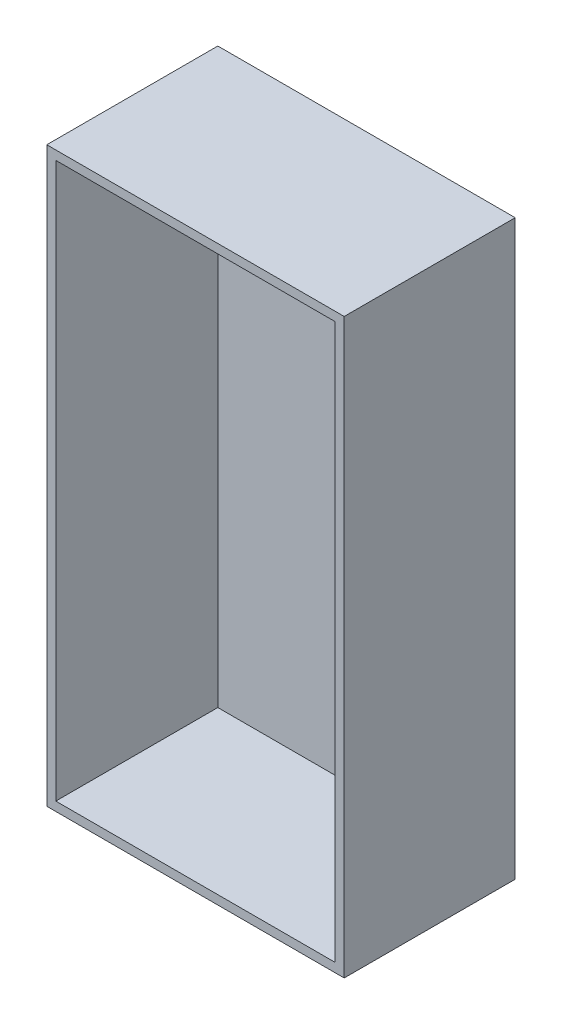
ISO-10303-21;
HEADER;
FILE_DESCRIPTION(('STEP AP214'),'2;1');
FILE_NAME('part.step','',(''),(''),'','','');
FILE_SCHEMA(('AUTOMOTIVE_DESIGN { 1 0 10303 214 1 1 1 1 }'));
ENDSEC;
DATA;
#1=APPLICATION_CONTEXT('core data for automotive mechanical design processes');
#2=APPLICATION_PROTOCOL_DEFINITION('international standard','automotive_design',2000,#1);
#3=PRODUCT_CONTEXT('',#1,'mechanical');
#4=PRODUCT('Part','Part','',(#3));
#5=PRODUCT_RELATED_PRODUCT_CATEGORY('part','',(#4));
#6=PRODUCT_DEFINITION_FORMATION('','',#4);
#7=PRODUCT_DEFINITION_CONTEXT('part definition',#1,'design');
#8=PRODUCT_DEFINITION('design','',#6,#7);
#9=PRODUCT_DEFINITION_SHAPE('','',#8);
#10=(LENGTH_UNIT() NAMED_UNIT(*) SI_UNIT(.MILLI.,.METRE.));
#11=(NAMED_UNIT(*) PLANE_ANGLE_UNIT() SI_UNIT($,.RADIAN.));
#12=(NAMED_UNIT(*) SI_UNIT($,.STERADIAN.) SOLID_ANGLE_UNIT());
#13=UNCERTAINTY_MEASURE_WITH_UNIT(LENGTH_MEASURE(1.E-05),#10,'distance_accuracy_value','');
#14=(GEOMETRIC_REPRESENTATION_CONTEXT(3) GLOBAL_UNCERTAINTY_ASSIGNED_CONTEXT((#13)) GLOBAL_UNIT_ASSIGNED_CONTEXT((#10,
#11,#12)) REPRESENTATION_CONTEXT('',''));
#15=CARTESIAN_POINT('',(0.,0.,0.));
#16=DIRECTION('',(0.,0.,1.));
#17=DIRECTION('',(1.,0.,0.));
#18=AXIS2_PLACEMENT_3D('',#15,#16,#17);
#19=CARTESIAN_POINT('',(84.6836862644915,152.134877954027,45.72));
#20=DIRECTION('',(1.,0.,0.));
#21=DIRECTION('',(0.,0.,-1.));
#22=AXIS2_PLACEMENT_3D('',#19,#20,#21);
#23=PLANE('',#22);
#24=DIRECTION('',(0.,-1.,0.));
#25=VECTOR('',#24,1.);
#26=CARTESIAN_POINT('',(84.6836862644915,0.,-2.54));
#27=LINE('',#26,#25);
#28=CARTESIAN_POINT('',(84.6836862644915,154.674877954027,-2.54));
#29=VERTEX_POINT('',#28);
#30=CARTESIAN_POINT('',(84.6836862644915,-6.98746866724251,-2.54));
#31=VERTEX_POINT('',#30);
#32=EDGE_CURVE('E156',#29,#31,#27,.T.);
#33=ORIENTED_EDGE('',*,*,#32,.F.);
#34=DIRECTION('',(0.,0.,-1.));
#35=VECTOR('',#34,1.);
#36=CARTESIAN_POINT('',(84.6836862644915,154.674877954027,45.72));
#37=LINE('',#36,#35);
#38=CARTESIAN_POINT('',(84.6836862644915,154.674877954027,45.72));
#39=VERTEX_POINT('',#38);
#40=EDGE_CURVE('E11',#39,#29,#37,.T.);
#41=ORIENTED_EDGE('',*,*,#40,.F.);
#42=DIRECTION('',(0.,-1.,0.));
#43=VECTOR('',#42,1.);
#44=CARTESIAN_POINT('',(84.6836862644915,0.,45.72));
#45=LINE('',#44,#43);
#46=CARTESIAN_POINT('',(84.6836862644915,-6.98746866724251,45.72));
#47=VERTEX_POINT('',#46);
#48=EDGE_CURVE('E167',#39,#47,#45,.T.);
#49=ORIENTED_EDGE('',*,*,#48,.T.);
#50=DIRECTION('',(0.,0.,-1.));
#51=VECTOR('',#50,1.);
#52=CARTESIAN_POINT('',(84.6836862644915,-6.98746866724251,45.72));
#53=LINE('',#52,#51);
#54=EDGE_CURVE('E77',#47,#31,#53,.T.);
#55=ORIENTED_EDGE('',*,*,#54,.T.);
#56=EDGE_LOOP('',(#33,#41,#49,#55));
#57=FACE_BOUND('',#56,.T.);
#58=ADVANCED_FACE('F36',(#57),#23,.T.);
#59=CARTESIAN_POINT('',(9.65509190397576,154.674877954027,45.72));
#60=DIRECTION('',(0.,1.,0.));
#61=DIRECTION('',(0.,0.,1.));
#62=AXIS2_PLACEMENT_3D('',#59,#60,#61);
#63=PLANE('',#62);
#64=DIRECTION('',(1.,0.,0.));
#65=VECTOR('',#64,1.);
#66=CARTESIAN_POINT('',(0.,154.674877954027,-2.54));
#67=LINE('',#66,#65);
#68=CARTESIAN_POINT('',(0.765091903975752,154.674877954027,-2.54));
#69=VERTEX_POINT('',#68);
#70=EDGE_CURVE('E164',#69,#29,#67,.T.);
#71=ORIENTED_EDGE('',*,*,#70,.F.);
#72=DIRECTION('',(0.,0.,-1.));
#73=VECTOR('',#72,1.);
#74=CARTESIAN_POINT('',(0.765091903975752,154.674877954027,45.72));
#75=LINE('',#74,#73);
#76=CARTESIAN_POINT('',(0.765091903975752,154.674877954027,45.72));
#77=VERTEX_POINT('',#76);
#78=EDGE_CURVE('E45',#77,#69,#75,.T.);
#79=ORIENTED_EDGE('',*,*,#78,.F.);
#80=DIRECTION('',(1.,0.,0.));
#81=VECTOR('',#80,1.);
#82=CARTESIAN_POINT('',(0.,154.674877954027,45.72));
#83=LINE('',#82,#81);
#84=EDGE_CURVE('E61',#77,#39,#83,.T.);
#85=ORIENTED_EDGE('',*,*,#84,.T.);
#86=ORIENTED_EDGE('',*,*,#40,.T.);
#87=EDGE_LOOP('',(#71,#79,#85,#86));
#88=FACE_BOUND('',#87,.T.);
#89=ADVANCED_FACE('F180',(#88),#63,.T.);
#90=CARTESIAN_POINT('',(0.765091903975752,92.9140449039079,45.72));
#91=DIRECTION('',(-1.,0.,0.));
#92=DIRECTION('',(0.,0.,1.));
#93=AXIS2_PLACEMENT_3D('',#90,#91,#92);
#94=PLANE('',#93);
#95=DIRECTION('',(0.,1.,0.));
#96=VECTOR('',#95,1.);
#97=CARTESIAN_POINT('',(0.765091903975752,0.,-2.54));
#98=LINE('',#97,#96);
#99=CARTESIAN_POINT('',(0.765091903975752,-6.98746866724251,-2.54));
#100=VERTEX_POINT('',#99);
#101=EDGE_CURVE('E93',#100,#69,#98,.T.);
#102=ORIENTED_EDGE('',*,*,#101,.F.);
#103=DIRECTION('',(0.,0.,-1.));
#104=VECTOR('',#103,1.);
#105=CARTESIAN_POINT('',(0.765091903975752,-6.98746866724251,45.72));
#106=LINE('',#105,#104);
#107=CARTESIAN_POINT('',(0.765091903975752,-6.98746866724251,45.72));
#108=VERTEX_POINT('',#107);
#109=EDGE_CURVE('E163',#108,#100,#106,.T.);
#110=ORIENTED_EDGE('',*,*,#109,.F.);
#111=DIRECTION('',(0.,-1.,0.));
#112=VECTOR('',#111,1.);
#113=CARTESIAN_POINT('',(0.765091903975752,92.9140449039079,45.72));
#114=LINE('',#113,#112);
#115=EDGE_CURVE('E174',#77,#108,#114,.T.);
#116=ORIENTED_EDGE('',*,*,#115,.F.);
#117=ORIENTED_EDGE('',*,*,#78,.T.);
#118=EDGE_LOOP('',(#102,#110,#116,#117));
#119=FACE_BOUND('',#118,.T.);
#120=ADVANCED_FACE('F181',(#119),#94,.T.);
#121=CARTESIAN_POINT('',(3.30509190397575,-6.98746866724251,45.72));
#122=DIRECTION('',(0.,1.,0.));
#123=DIRECTION('',(0.,0.,1.));
#124=AXIS2_PLACEMENT_3D('',#121,#122,#123);
#125=PLANE('',#124);
#126=DIRECTION('',(1.,0.,0.));
#127=VECTOR('',#126,1.);
#128=CARTESIAN_POINT('',(0.,-6.98746866724251,-2.54));
#129=LINE('',#128,#127);
#130=EDGE_CURVE('E97',#100,#31,#129,.T.);
#131=ORIENTED_EDGE('',*,*,#130,.T.);
#132=ORIENTED_EDGE('',*,*,#54,.F.);
#133=DIRECTION('',(-1.,0.,0.));
#134=VECTOR('',#133,1.);
#135=CARTESIAN_POINT('',(3.30509190397575,-6.98746866724251,45.72));
#136=LINE('',#135,#134);
#137=EDGE_CURVE('E40',#47,#108,#136,.T.);
#138=ORIENTED_EDGE('',*,*,#137,.T.);
#139=ORIENTED_EDGE('',*,*,#109,.T.);
#140=EDGE_LOOP('',(#131,#132,#138,#139));
#141=FACE_BOUND('',#140,.T.);
#142=ADVANCED_FACE('F176',(#141),#125,.F.);
#143=CARTESIAN_POINT('',(0.,0.,45.72));
#144=DIRECTION('',(0.,0.,-1.));
#145=DIRECTION('',(-1.,0.,0.));
#146=AXIS2_PLACEMENT_3D('',#143,#144,#145);
#147=PLANE('',#146);
#148=DIRECTION('',(1.,0.,0.));
#149=VECTOR('',#148,1.);
#150=CARTESIAN_POINT('',(3.30509190397575,152.134877954027,45.72));
#151=LINE('',#150,#149);
#152=CARTESIAN_POINT('',(3.30509190397575,152.134877954027,45.72));
#153=VERTEX_POINT('',#152);
#154=CARTESIAN_POINT('',(82.1436862644915,152.134877954027,45.72));
#155=VERTEX_POINT('',#154);
#156=EDGE_CURVE('E133',#153,#155,#151,.T.);
#157=ORIENTED_EDGE('',*,*,#156,.T.);
#158=DIRECTION('',(0.,-1.,0.));
#159=VECTOR('',#158,1.);
#160=CARTESIAN_POINT('',(82.1436862644915,152.134877954027,45.72));
#161=LINE('',#160,#159);
#162=CARTESIAN_POINT('',(82.1436862644915,-4.44746866724251,45.72));
#163=VERTEX_POINT('',#162);
#164=EDGE_CURVE('E130',#155,#163,#161,.T.);
#165=ORIENTED_EDGE('',*,*,#164,.T.);
#166=DIRECTION('',(-1.,0.,0.));
#167=VECTOR('',#166,1.);
#168=CARTESIAN_POINT('',(82.1436862644915,-4.44746866724251,45.72));
#169=LINE('',#168,#167);
#170=CARTESIAN_POINT('',(3.30509190397575,-4.44746866724251,45.72));
#171=VERTEX_POINT('',#170);
#172=EDGE_CURVE('E136',#163,#171,#169,.T.);
#173=ORIENTED_EDGE('',*,*,#172,.T.);
#174=DIRECTION('',(0.,-1.,0.));
#175=VECTOR('',#174,1.);
#176=CARTESIAN_POINT('',(3.30509190397575,92.9140449039079,45.72));
#177=LINE('',#176,#175);
#178=EDGE_CURVE('E140',#153,#171,#177,.T.);
#179=ORIENTED_EDGE('',*,*,#178,.F.);
#180=EDGE_LOOP('',(#157,#165,#173,#179));
#181=FACE_BOUND('',#180,.T.);
#182=ORIENTED_EDGE('',*,*,#48,.F.);
#183=ORIENTED_EDGE('',*,*,#84,.F.);
#184=ORIENTED_EDGE('',*,*,#115,.T.);
#185=ORIENTED_EDGE('',*,*,#137,.F.);
#186=EDGE_LOOP('',(#182,#183,#184,#185));
#187=FACE_BOUND('',#186,.T.);
#188=ADVANCED_FACE('F142',(#181,#187),#147,.F.);
#189=CARTESIAN_POINT('',(0.,0.,-2.54));
#190=DIRECTION('',(0.,0.,-1.));
#191=DIRECTION('',(-1.,0.,0.));
#192=AXIS2_PLACEMENT_3D('',#189,#190,#191);
#193=PLANE('',#192);
#194=ORIENTED_EDGE('',*,*,#32,.T.);
#195=ORIENTED_EDGE('',*,*,#130,.F.);
#196=ORIENTED_EDGE('',*,*,#101,.T.);
#197=ORIENTED_EDGE('',*,*,#70,.T.);
#198=EDGE_LOOP('',(#194,#195,#196,#197));
#199=FACE_BOUND('',#198,.T.);
#200=ADVANCED_FACE('F38',(#199),#193,.T.);
#201=CARTESIAN_POINT('',(82.1436862644915,152.134877954027,45.72));
#202=DIRECTION('',(1.,0.,0.));
#203=DIRECTION('',(0.,0.,-1.));
#204=AXIS2_PLACEMENT_3D('',#201,#202,#203);
#205=PLANE('',#204);
#206=DIRECTION('',(0.,-1.,0.));
#207=VECTOR('',#206,1.);
#208=CARTESIAN_POINT('',(82.1436862644915,152.134877954027,0.));
#209=LINE('',#208,#207);
#210=CARTESIAN_POINT('',(82.1436862644915,152.134877954027,0.));
#211=VERTEX_POINT('',#210);
#212=CARTESIAN_POINT('',(82.1436862644915,-4.44746866724251,0.));
#213=VERTEX_POINT('',#212);
#214=EDGE_CURVE('E132',#211,#213,#209,.T.);
#215=ORIENTED_EDGE('',*,*,#214,.T.);
#216=DIRECTION('',(0.,0.,-1.));
#217=VECTOR('',#216,1.);
#218=CARTESIAN_POINT('',(82.1436862644915,-4.44746866724251,45.72));
#219=LINE('',#218,#217);
#220=EDGE_CURVE('E127',#163,#213,#219,.T.);
#221=ORIENTED_EDGE('',*,*,#220,.F.);
#222=ORIENTED_EDGE('',*,*,#164,.F.);
#223=DIRECTION('',(0.,0.,-1.));
#224=VECTOR('',#223,1.);
#225=CARTESIAN_POINT('',(82.1436862644915,152.134877954027,45.72));
#226=LINE('',#225,#224);
#227=EDGE_CURVE('E105',#155,#211,#226,.T.);
#228=ORIENTED_EDGE('',*,*,#227,.T.);
#229=EDGE_LOOP('',(#215,#221,#222,#228));
#230=FACE_BOUND('',#229,.T.);
#231=ADVANCED_FACE('F128',(#230),#205,.F.);
#232=CARTESIAN_POINT('',(9.65509190397576,152.134877954027,45.72));
#233=DIRECTION('',(0.,1.,0.));
#234=DIRECTION('',(0.,0.,1.));
#235=AXIS2_PLACEMENT_3D('',#232,#233,#234);
#236=PLANE('',#235);
#237=DIRECTION('',(1.,0.,0.));
#238=VECTOR('',#237,1.);
#239=CARTESIAN_POINT('',(9.65509190397576,152.134877954027,0.));
#240=LINE('',#239,#238);
#241=CARTESIAN_POINT('',(3.30509190397575,152.134877954027,0.));
#242=VERTEX_POINT('',#241);
#243=EDGE_CURVE('E121',#242,#211,#240,.T.);
#244=ORIENTED_EDGE('',*,*,#243,.T.);
#245=ORIENTED_EDGE('',*,*,#227,.F.);
#246=ORIENTED_EDGE('',*,*,#156,.F.);
#247=DIRECTION('',(0.,0.,-1.));
#248=VECTOR('',#247,1.);
#249=CARTESIAN_POINT('',(3.30509190397575,152.134877954027,45.72));
#250=LINE('',#249,#248);
#251=EDGE_CURVE('E157',#153,#242,#250,.T.);
#252=ORIENTED_EDGE('',*,*,#251,.T.);
#253=EDGE_LOOP('',(#244,#245,#246,#252));
#254=FACE_BOUND('',#253,.T.);
#255=ADVANCED_FACE('F198',(#254),#236,.F.);
#256=CARTESIAN_POINT('',(3.30509190397575,92.9140449039079,45.72));
#257=DIRECTION('',(-1.,0.,0.));
#258=DIRECTION('',(0.,0.,1.));
#259=AXIS2_PLACEMENT_3D('',#256,#257,#258);
#260=PLANE('',#259);
#261=DIRECTION('',(0.,1.,0.));
#262=VECTOR('',#261,1.);
#263=CARTESIAN_POINT('',(3.30509190397575,92.9140449039079,0.));
#264=LINE('',#263,#262);
#265=CARTESIAN_POINT('',(3.30509190397575,-4.44746866724251,0.));
#266=VERTEX_POINT('',#265);
#267=EDGE_CURVE('E145',#266,#242,#264,.T.);
#268=ORIENTED_EDGE('',*,*,#267,.T.);
#269=ORIENTED_EDGE('',*,*,#251,.F.);
#270=ORIENTED_EDGE('',*,*,#178,.T.);
#271=DIRECTION('',(0.,0.,-1.));
#272=VECTOR('',#271,1.);
#273=CARTESIAN_POINT('',(3.30509190397575,-4.44746866724251,45.72));
#274=LINE('',#273,#272);
#275=EDGE_CURVE('E53',#171,#266,#274,.T.);
#276=ORIENTED_EDGE('',*,*,#275,.T.);
#277=EDGE_LOOP('',(#268,#269,#270,#276));
#278=FACE_BOUND('',#277,.T.);
#279=ADVANCED_FACE('F202',(#278),#260,.F.);
#280=CARTESIAN_POINT('',(3.30509190397575,-4.44746866724251,45.72));
#281=DIRECTION('',(0.,1.,0.));
#282=DIRECTION('',(0.,0.,1.));
#283=AXIS2_PLACEMENT_3D('',#280,#281,#282);
#284=PLANE('',#283);
#285=DIRECTION('',(1.,0.,0.));
#286=VECTOR('',#285,1.);
#287=CARTESIAN_POINT('',(3.30509190397575,-4.44746866724251,0.));
#288=LINE('',#287,#286);
#289=EDGE_CURVE('E151',#266,#213,#288,.T.);
#290=ORIENTED_EDGE('',*,*,#289,.F.);
#291=ORIENTED_EDGE('',*,*,#275,.F.);
#292=ORIENTED_EDGE('',*,*,#172,.F.);
#293=ORIENTED_EDGE('',*,*,#220,.T.);
#294=EDGE_LOOP('',(#290,#291,#292,#293));
#295=FACE_BOUND('',#294,.T.);
#296=ADVANCED_FACE('F137',(#295),#284,.T.);
#297=CARTESIAN_POINT('',(0.,0.,0.));
#298=DIRECTION('',(0.,0.,-1.));
#299=DIRECTION('',(-1.,0.,0.));
#300=AXIS2_PLACEMENT_3D('',#297,#298,#299);
#301=PLANE('',#300);
#302=ORIENTED_EDGE('',*,*,#214,.F.);
#303=ORIENTED_EDGE('',*,*,#243,.F.);
#304=ORIENTED_EDGE('',*,*,#267,.F.);
#305=ORIENTED_EDGE('',*,*,#289,.T.);
#306=EDGE_LOOP('',(#302,#303,#304,#305));
#307=FACE_BOUND('',#306,.T.);
#308=ADVANCED_FACE('F201',(#307),#301,.F.);
#309=CLOSED_SHELL('',(#58,#89,#120,#142,#188,#200,#231,#255,#279,#296,#308));
#310=MANIFOLD_SOLID_BREP('B2',#309);
#311=ADVANCED_BREP_SHAPE_REPRESENTATION('',(#18,#310),#14);
#312=SHAPE_DEFINITION_REPRESENTATION(#9,#311);
ENDSEC;
END-ISO-10303-21;
